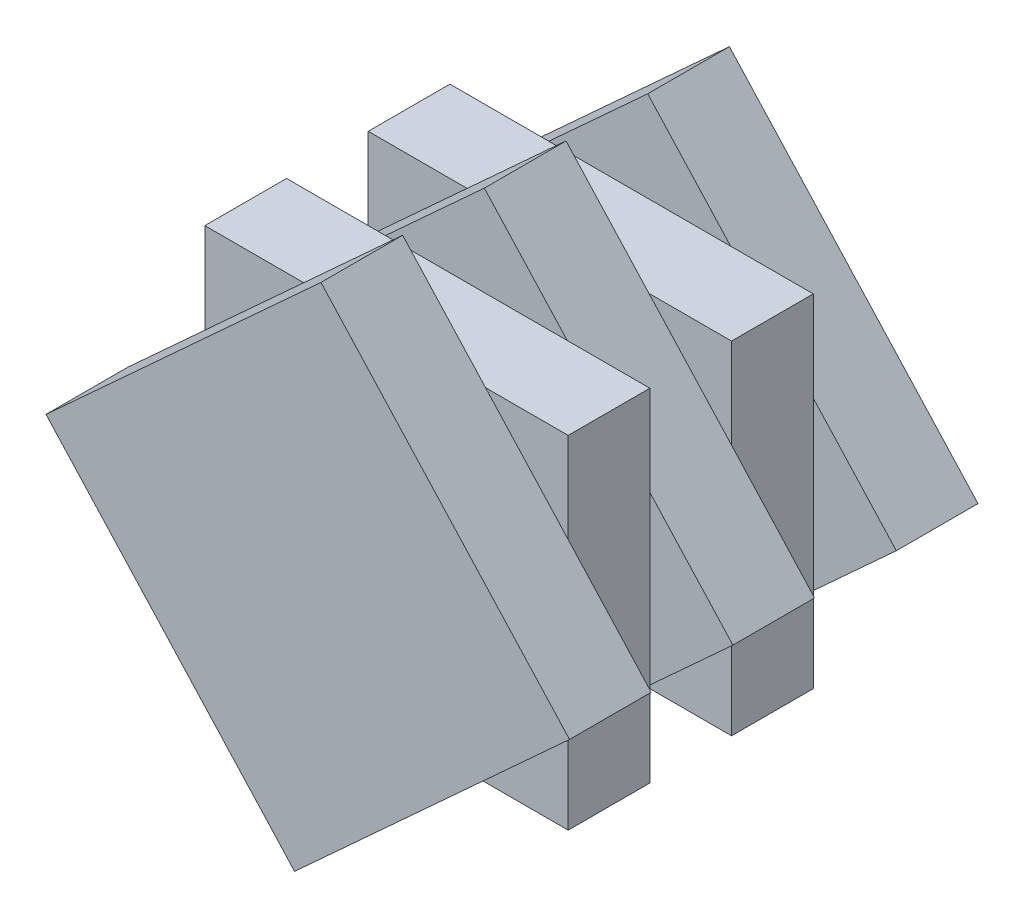
ISO-10303-21;
HEADER;
FILE_DESCRIPTION(('STEP AP214'),'2;1');
FILE_NAME('part.step','',(''),(''),'','','');
FILE_SCHEMA(('AUTOMOTIVE_DESIGN { 1 0 10303 214 1 1 1 1 }'));
ENDSEC;
DATA;
#1=APPLICATION_CONTEXT('core data for automotive mechanical design processes');
#2=APPLICATION_PROTOCOL_DEFINITION('international standard','automotive_design',2000,#1);
#3=PRODUCT_CONTEXT('',#1,'mechanical');
#4=PRODUCT('Part','Part','',(#3));
#5=PRODUCT_RELATED_PRODUCT_CATEGORY('part','',(#4));
#6=PRODUCT_DEFINITION_FORMATION('','',#4);
#7=PRODUCT_DEFINITION_CONTEXT('part definition',#1,'design');
#8=PRODUCT_DEFINITION('design','',#6,#7);
#9=PRODUCT_DEFINITION_SHAPE('','',#8);
#10=(LENGTH_UNIT() NAMED_UNIT(*) SI_UNIT(.MILLI.,.METRE.));
#11=(NAMED_UNIT(*) PLANE_ANGLE_UNIT() SI_UNIT($,.RADIAN.));
#12=(NAMED_UNIT(*) SI_UNIT($,.STERADIAN.) SOLID_ANGLE_UNIT());
#13=UNCERTAINTY_MEASURE_WITH_UNIT(LENGTH_MEASURE(1.E-05),#10,'distance_accuracy_value','');
#14=(GEOMETRIC_REPRESENTATION_CONTEXT(3) GLOBAL_UNCERTAINTY_ASSIGNED_CONTEXT((#13)) GLOBAL_UNIT_ASSIGNED_CONTEXT((#10,
#11,#12)) REPRESENTATION_CONTEXT('',''));
#15=CARTESIAN_POINT('',(0.,0.,0.));
#16=DIRECTION('',(0.,0.,1.));
#17=DIRECTION('',(1.,0.,0.));
#18=AXIS2_PLACEMENT_3D('',#15,#16,#17);
#19=CARTESIAN_POINT('',(0.,0.,0.));
#20=DIRECTION('',(0.,0.,1.));
#21=DIRECTION('',(1.,0.,0.));
#22=AXIS2_PLACEMENT_3D('',#19,#20,#21);
#23=PLANE('',#22);
#24=DIRECTION('',(0.,-1.,0.));
#25=VECTOR('',#24,1.);
#26=CARTESIAN_POINT('',(-55.5984454207503,52.3150726596823,0.));
#27=LINE('',#26,#25);
#28=CARTESIAN_POINT('',(-55.5984454207503,-22.8034381181716,0.));
#29=VERTEX_POINT('',#28);
#30=CARTESIAN_POINT('',(-55.5984454207503,-52.3150726596823,0.));
#31=VERTEX_POINT('',#30);
#32=EDGE_CURVE('E477',#29,#31,#27,.T.);
#33=ORIENTED_EDGE('',*,*,#32,.F.);
#34=DIRECTION('',(0.675307046547055,-0.737536706126477,0.));
#35=VECTOR('',#34,1.);
#36=CARTESIAN_POINT('',(-3.13282413407734,-80.1037753595892,0.));
#37=LINE('',#36,#35);
#38=CARTESIAN_POINT('',(-28.5768550436796,-52.3150726596823,0.));
#39=VERTEX_POINT('',#38);
#40=EDGE_CURVE('E11',#29,#39,#37,.T.);
#41=ORIENTED_EDGE('',*,*,#40,.T.);
#42=DIRECTION('',(1.,0.,0.));
#43=VECTOR('',#42,1.);
#44=CARTESIAN_POINT('',(-55.5984454207503,-52.3150726596823,0.));
#45=LINE('',#44,#43);
#46=EDGE_CURVE('E484',#31,#39,#45,.T.);
#47=ORIENTED_EDGE('',*,*,#46,.F.);
#48=EDGE_LOOP('',(#33,#41,#47));
#49=FACE_BOUND('',#48,.T.);
#50=ADVANCED_FACE('F39',(#49),#23,.F.);
#51=CARTESIAN_POINT('',(27.2166122617254,-52.3150726596823,0.));
#52=VERTEX_POINT('',#51);
#53=CARTESIAN_POINT('',(55.5984454207503,-52.3150726596823,0.));
#54=VERTEX_POINT('',#53);
#55=EDGE_CURVE('E482',#52,#54,#45,.T.);
#56=ORIENTED_EDGE('',*,*,#55,.F.);
#57=DIRECTION('',(0.737536706126477,0.675307046547055,0.));
#58=VECTOR('',#57,1.);
#59=CARTESIAN_POINT('',(-3.13282413407734,-80.1037753595892,0.));
#60=LINE('',#59,#58);
#61=CARTESIAN_POINT('',(55.5984454207503,-26.3279566734502,0.));
#62=VERTEX_POINT('',#61);
#63=EDGE_CURVE('E48',#52,#62,#60,.T.);
#64=ORIENTED_EDGE('',*,*,#63,.T.);
#65=DIRECTION('',(0.,1.,0.));
#66=VECTOR('',#65,1.);
#67=CARTESIAN_POINT('',(55.5984454207503,52.3150726596823,0.));
#68=LINE('',#67,#66);
#69=EDGE_CURVE('E469',#54,#62,#68,.T.);
#70=ORIENTED_EDGE('',*,*,#69,.F.);
#71=EDGE_LOOP('',(#56,#64,#70));
#72=FACE_BOUND('',#71,.T.);
#73=ADVANCED_FACE('F585',(#72),#23,.F.);
#74=CARTESIAN_POINT('',(55.5984454207503,24.6958593374742,0.));
#75=VERTEX_POINT('',#74);
#76=CARTESIAN_POINT('',(55.5984454207503,52.3150726596823,0.));
#77=VERTEX_POINT('',#76);
#78=EDGE_CURVE('E448',#75,#77,#68,.T.);
#79=ORIENTED_EDGE('',*,*,#78,.F.);
#80=DIRECTION('',(-0.675307046547055,0.737536706126477,0.));
#81=VECTOR('',#80,1.);
#82=CARTESIAN_POINT('',(81.0115577835478,-3.05907566626378,0.));
#83=LINE('',#82,#81);
#84=CARTESIAN_POINT('',(30.3096032226035,52.3150726596823,0.));
#85=VERTEX_POINT('',#84);
#86=EDGE_CURVE('E531',#75,#85,#83,.T.);
#87=ORIENTED_EDGE('',*,*,#86,.T.);
#88=DIRECTION('',(-1.,0.,0.));
#89=VECTOR('',#88,1.);
#90=CARTESIAN_POINT('',(-55.5984454207503,52.3150726596823,0.));
#91=LINE('',#90,#89);
#92=EDGE_CURVE('E474',#77,#85,#91,.T.);
#93=ORIENTED_EDGE('',*,*,#92,.F.);
#94=EDGE_LOOP('',(#79,#87,#93));
#95=FACE_BOUND('',#94,.T.);
#96=ADVANCED_FACE('F530',(#95),#23,.F.);
#97=CARTESIAN_POINT('',(0.,0.,75.));
#98=DIRECTION('',(0.,0.,1.));
#99=DIRECTION('',(1.,0.,0.));
#100=AXIS2_PLACEMENT_3D('',#97,#98,#99);
#101=PLANE('',#100);
#102=DIRECTION('',(0.675307046547055,-0.737536706126477,0.));
#103=VECTOR('',#102,1.);
#104=CARTESIAN_POINT('',(-3.13282413407734,-80.1037753595892,75.));
#105=LINE('',#104,#103);
#106=CARTESIAN_POINT('',(-55.5984454207503,-22.8034381181716,75.));
#107=VERTEX_POINT('',#106);
#108=CARTESIAN_POINT('',(-28.5768550436796,-52.3150726596823,75.));
#109=VERTEX_POINT('',#108);
#110=EDGE_CURVE('E304',#107,#109,#105,.T.);
#111=ORIENTED_EDGE('',*,*,#110,.F.);
#112=DIRECTION('',(0.,-1.,0.));
#113=VECTOR('',#112,1.);
#114=CARTESIAN_POINT('',(-55.5984454207503,52.3150726596823,75.));
#115=LINE('',#114,#113);
#116=CARTESIAN_POINT('',(-55.5984454207503,-52.3150726596823,75.));
#117=VERTEX_POINT('',#116);
#118=EDGE_CURVE('E355',#107,#117,#115,.T.);
#119=ORIENTED_EDGE('',*,*,#118,.T.);
#120=DIRECTION('',(1.,0.,0.));
#121=VECTOR('',#120,1.);
#122=CARTESIAN_POINT('',(-55.5984454207503,-52.3150726596823,75.));
#123=LINE('',#122,#121);
#124=EDGE_CURVE('E362',#117,#109,#123,.T.);
#125=ORIENTED_EDGE('',*,*,#124,.T.);
#126=EDGE_LOOP('',(#111,#119,#125));
#127=FACE_BOUND('',#126,.T.);
#128=ADVANCED_FACE('F615',(#127),#101,.T.);
#129=DIRECTION('',(-0.737536706126477,-0.675307046547055,0.));
#130=VECTOR('',#129,1.);
#131=CARTESIAN_POINT('',(-79.2066084037279,2.98022111238414,75.));
#132=LINE('',#131,#130);
#133=CARTESIAN_POINT('',(-25.3255418674295,52.3150726596823,75.));
#134=VERTEX_POINT('',#133);
#135=CARTESIAN_POINT('',(-55.5984454207503,24.596445343673,75.));
#136=VERTEX_POINT('',#135);
#137=EDGE_CURVE('E334',#134,#136,#132,.T.);
#138=ORIENTED_EDGE('',*,*,#137,.F.);
#139=DIRECTION('',(-1.,0.,0.));
#140=VECTOR('',#139,1.);
#141=CARTESIAN_POINT('',(-55.5984454207503,52.3150726596823,75.));
#142=LINE('',#141,#140);
#143=CARTESIAN_POINT('',(-55.5984454207503,52.3150726596823,75.));
#144=VERTEX_POINT('',#143);
#145=EDGE_CURVE('E349',#134,#144,#142,.T.);
#146=ORIENTED_EDGE('',*,*,#145,.T.);
#147=EDGE_CURVE('E357',#144,#136,#115,.T.);
#148=ORIENTED_EDGE('',*,*,#147,.T.);
#149=EDGE_LOOP('',(#138,#146,#148));
#150=FACE_BOUND('',#149,.T.);
#151=ADVANCED_FACE('F621',(#150),#101,.T.);
#152=DIRECTION('',(-0.675307046547055,0.737536706126477,0.));
#153=VECTOR('',#152,1.);
#154=CARTESIAN_POINT('',(81.0115577835478,-3.05907566626378,75.));
#155=LINE('',#154,#153);
#156=CARTESIAN_POINT('',(55.5984454207503,24.6958593374742,75.));
#157=VERTEX_POINT('',#156);
#158=CARTESIAN_POINT('',(30.3096032226035,52.3150726596823,75.));
#159=VERTEX_POINT('',#158);
#160=EDGE_CURVE('E331',#157,#159,#155,.T.);
#161=ORIENTED_EDGE('',*,*,#160,.F.);
#162=DIRECTION('',(0.,1.,0.));
#163=VECTOR('',#162,1.);
#164=CARTESIAN_POINT('',(55.5984454207503,52.3150726596823,75.));
#165=LINE('',#164,#163);
#166=CARTESIAN_POINT('',(55.5984454207503,52.3150726596823,75.));
#167=VERTEX_POINT('',#166);
#168=EDGE_CURVE('E351',#157,#167,#165,.T.);
#169=ORIENTED_EDGE('',*,*,#168,.T.);
#170=EDGE_CURVE('E352',#167,#159,#142,.T.);
#171=ORIENTED_EDGE('',*,*,#170,.T.);
#172=EDGE_LOOP('',(#161,#169,#171));
#173=FACE_BOUND('',#172,.T.);
#174=ADVANCED_FACE('F720',(#173),#101,.T.);
#175=CARTESIAN_POINT('',(0.,0.,50.));
#176=DIRECTION('',(0.,0.,-1.));
#177=DIRECTION('',(-1.,0.,0.));
#178=AXIS2_PLACEMENT_3D('',#175,#176,#177);
#179=PLANE('',#178);
#180=DIRECTION('',(0.,1.,0.));
#181=VECTOR('',#180,1.);
#182=CARTESIAN_POINT('',(55.5984454207503,52.3150726596823,50.));
#183=LINE('',#182,#181);
#184=CARTESIAN_POINT('',(55.5984454207503,-26.3279566734502,50.));
#185=VERTEX_POINT('',#184);
#186=CARTESIAN_POINT('',(55.5984454207503,24.6958593374742,50.));
#187=VERTEX_POINT('',#186);
#188=EDGE_CURVE('E371',#185,#187,#183,.T.);
#189=ORIENTED_EDGE('',*,*,#188,.F.);
#190=DIRECTION('',(0.737536706126477,0.675307046547055,0.));
#191=VECTOR('',#190,1.);
#192=CARTESIAN_POINT('',(-3.13282413407734,-80.1037753595892,50.));
#193=LINE('',#192,#191);
#194=CARTESIAN_POINT('',(81.0115577835478,-3.05907566626378,50.));
#195=VERTEX_POINT('',#194);
#196=EDGE_CURVE('E401',#185,#195,#193,.T.);
#197=ORIENTED_EDGE('',*,*,#196,.T.);
#198=DIRECTION('',(-0.675307046547055,0.737536706126477,0.));
#199=VECTOR('',#198,1.);
#200=CARTESIAN_POINT('',(81.0115577835478,-3.05907566626378,50.));
#201=LINE('',#200,#199);
#202=EDGE_CURVE('E409',#195,#187,#201,.T.);
#203=ORIENTED_EDGE('',*,*,#202,.T.);
#204=EDGE_LOOP('',(#189,#197,#203));
#205=FACE_BOUND('',#204,.T.);
#206=ADVANCED_FACE('F836',(#205),#179,.F.);
#207=DIRECTION('',(1.,0.,0.));
#208=VECTOR('',#207,1.);
#209=CARTESIAN_POINT('',(-55.5984454207503,-52.3150726596823,50.));
#210=LINE('',#209,#208);
#211=CARTESIAN_POINT('',(-28.5768550436796,-52.3150726596823,50.));
#212=VERTEX_POINT('',#211);
#213=CARTESIAN_POINT('',(27.2166122617254,-52.3150726596823,50.));
#214=VERTEX_POINT('',#213);
#215=EDGE_CURVE('E385',#212,#214,#210,.T.);
#216=ORIENTED_EDGE('',*,*,#215,.F.);
#217=DIRECTION('',(0.675307046547055,-0.737536706126477,0.));
#218=VECTOR('',#217,1.);
#219=CARTESIAN_POINT('',(-3.13282413407734,-80.1037753595892,50.));
#220=LINE('',#219,#218);
#221=CARTESIAN_POINT('',(-3.13282413407734,-80.1037753595892,50.));
#222=VERTEX_POINT('',#221);
#223=EDGE_CURVE('E403',#212,#222,#220,.T.);
#224=ORIENTED_EDGE('',*,*,#223,.T.);
#225=EDGE_CURVE('E404',#222,#214,#193,.T.);
#226=ORIENTED_EDGE('',*,*,#225,.T.);
#227=EDGE_LOOP('',(#216,#224,#226));
#228=FACE_BOUND('',#227,.T.);
#229=ADVANCED_FACE('F843',(#228),#179,.F.);
#230=DIRECTION('',(0.,-1.,0.));
#231=VECTOR('',#230,1.);
#232=CARTESIAN_POINT('',(-55.5984454207503,52.3150726596823,50.));
#233=LINE('',#232,#231);
#234=CARTESIAN_POINT('',(-55.5984454207503,24.596445343673,50.));
#235=VERTEX_POINT('',#234);
#236=CARTESIAN_POINT('',(-55.5984454207503,-22.8034381181716,50.));
#237=VERTEX_POINT('',#236);
#238=EDGE_CURVE('E381',#235,#237,#233,.T.);
#239=ORIENTED_EDGE('',*,*,#238,.F.);
#240=DIRECTION('',(-0.737536706126477,-0.675307046547055,0.));
#241=VECTOR('',#240,1.);
#242=CARTESIAN_POINT('',(-79.2066084037279,2.98022111238414,50.));
#243=LINE('',#242,#241);
#244=CARTESIAN_POINT('',(-79.2066084037279,2.98022111238414,50.));
#245=VERTEX_POINT('',#244);
#246=EDGE_CURVE('E412',#235,#245,#243,.T.);
#247=ORIENTED_EDGE('',*,*,#246,.T.);
#248=EDGE_CURVE('E398',#245,#237,#220,.T.);
#249=ORIENTED_EDGE('',*,*,#248,.T.);
#250=EDGE_LOOP('',(#239,#247,#249));
#251=FACE_BOUND('',#250,.T.);
#252=ADVANCED_FACE('F833',(#251),#179,.F.);
#253=DIRECTION('',(-1.,0.,0.));
#254=VECTOR('',#253,1.);
#255=CARTESIAN_POINT('',(-55.5984454207503,52.3150726596823,50.));
#256=LINE('',#255,#254);
#257=CARTESIAN_POINT('',(30.3096032226034,52.3150726596823,50.));
#258=VERTEX_POINT('',#257);
#259=CARTESIAN_POINT('',(-25.3255418674295,52.3150726596823,50.));
#260=VERTEX_POINT('',#259);
#261=EDGE_CURVE('E376',#258,#260,#256,.T.);
#262=ORIENTED_EDGE('',*,*,#261,.F.);
#263=CARTESIAN_POINT('',(4.93777351389728,80.0249208057096,50.));
#264=VERTEX_POINT('',#263);
#265=EDGE_CURVE('E407',#258,#264,#201,.T.);
#266=ORIENTED_EDGE('',*,*,#265,.T.);
#267=EDGE_CURVE('E414',#264,#260,#243,.T.);
#268=ORIENTED_EDGE('',*,*,#267,.T.);
#269=EDGE_LOOP('',(#262,#266,#268));
#270=FACE_BOUND('',#269,.T.);
#271=ADVANCED_FACE('F829',(#270),#179,.F.);
#272=CARTESIAN_POINT('',(0.,0.,25.));
#273=DIRECTION('',(0.,0.,1.));
#274=DIRECTION('',(1.,0.,0.));
#275=AXIS2_PLACEMENT_3D('',#272,#273,#274);
#276=PLANE('',#275);
#277=DIRECTION('',(0.675307046547055,-0.737536706126477,0.));
#278=VECTOR('',#277,1.);
#279=CARTESIAN_POINT('',(-3.13282413407734,-80.1037753595892,25.));
#280=LINE('',#279,#278);
#281=CARTESIAN_POINT('',(-55.5984454207503,-22.8034381181716,25.));
#282=VERTEX_POINT('',#281);
#283=CARTESIAN_POINT('',(-28.5768550436796,-52.3150726596823,25.));
#284=VERTEX_POINT('',#283);
#285=EDGE_CURVE('E422',#282,#284,#280,.T.);
#286=ORIENTED_EDGE('',*,*,#285,.F.);
#287=DIRECTION('',(0.,-1.,0.));
#288=VECTOR('',#287,1.);
#289=CARTESIAN_POINT('',(-55.5984454207503,52.3150726596823,25.));
#290=LINE('',#289,#288);
#291=CARTESIAN_POINT('',(-55.5984454207503,-52.3150726596823,25.));
#292=VERTEX_POINT('',#291);
#293=EDGE_CURVE('E457',#282,#292,#290,.T.);
#294=ORIENTED_EDGE('',*,*,#293,.T.);
#295=DIRECTION('',(1.,0.,0.));
#296=VECTOR('',#295,1.);
#297=CARTESIAN_POINT('',(-55.5984454207503,-52.3150726596823,25.));
#298=LINE('',#297,#296);
#299=EDGE_CURVE('E464',#292,#284,#298,.T.);
#300=ORIENTED_EDGE('',*,*,#299,.T.);
#301=EDGE_LOOP('',(#286,#294,#300));
#302=FACE_BOUND('',#301,.T.);
#303=ADVANCED_FACE('F611',(#302),#276,.T.);
#304=DIRECTION('',(-0.737536706126477,-0.675307046547055,0.));
#305=VECTOR('',#304,1.);
#306=CARTESIAN_POINT('',(-79.2066084037279,2.98022111238414,25.));
#307=LINE('',#306,#305);
#308=CARTESIAN_POINT('',(-25.3255418674295,52.3150726596823,25.));
#309=VERTEX_POINT('',#308);
#310=CARTESIAN_POINT('',(-55.5984454207503,24.596445343673,25.));
#311=VERTEX_POINT('',#310);
#312=EDGE_CURVE('E436',#309,#311,#307,.T.);
#313=ORIENTED_EDGE('',*,*,#312,.F.);
#314=DIRECTION('',(-1.,0.,0.));
#315=VECTOR('',#314,1.);
#316=CARTESIAN_POINT('',(-55.5984454207503,52.3150726596823,25.));
#317=LINE('',#316,#315);
#318=CARTESIAN_POINT('',(-55.5984454207503,52.3150726596823,25.));
#319=VERTEX_POINT('',#318);
#320=EDGE_CURVE('E451',#309,#319,#317,.T.);
#321=ORIENTED_EDGE('',*,*,#320,.T.);
#322=EDGE_CURVE('E459',#319,#311,#290,.T.);
#323=ORIENTED_EDGE('',*,*,#322,.T.);
#324=EDGE_LOOP('',(#313,#321,#323));
#325=FACE_BOUND('',#324,.T.);
#326=ADVANCED_FACE('F906',(#325),#276,.T.);
#327=DIRECTION('',(-0.675307046547055,0.737536706126477,0.));
#328=VECTOR('',#327,1.);
#329=CARTESIAN_POINT('',(81.0115577835478,-3.05907566626378,25.));
#330=LINE('',#329,#328);
#331=CARTESIAN_POINT('',(55.5984454207503,24.6958593374742,25.));
#332=VERTEX_POINT('',#331);
#333=CARTESIAN_POINT('',(30.3096032226035,52.3150726596823,25.));
#334=VERTEX_POINT('',#333);
#335=EDGE_CURVE('E432',#332,#334,#330,.T.);
#336=ORIENTED_EDGE('',*,*,#335,.F.);
#337=DIRECTION('',(0.,1.,0.));
#338=VECTOR('',#337,1.);
#339=CARTESIAN_POINT('',(55.5984454207503,52.3150726596823,25.));
#340=LINE('',#339,#338);
#341=CARTESIAN_POINT('',(55.5984454207503,52.3150726596823,25.));
#342=VERTEX_POINT('',#341);
#343=EDGE_CURVE('E453',#332,#342,#340,.T.);
#344=ORIENTED_EDGE('',*,*,#343,.T.);
#345=EDGE_CURVE('E454',#342,#334,#317,.T.);
#346=ORIENTED_EDGE('',*,*,#345,.T.);
#347=EDGE_LOOP('',(#336,#344,#346));
#348=FACE_BOUND('',#347,.T.);
#349=ADVANCED_FACE('F520',(#348),#276,.T.);
#350=CARTESIAN_POINT('',(55.5984454207503,52.3150726596823,25.));
#351=DIRECTION('',(-1.,0.,0.));
#352=DIRECTION('',(0.,0.,1.));
#353=AXIS2_PLACEMENT_3D('',#350,#351,#352);
#354=PLANE('',#353);
#355=ORIENTED_EDGE('',*,*,#69,.T.);
#356=EDGE_CURVE('E473',#62,#75,#68,.T.);
#357=ORIENTED_EDGE('',*,*,#356,.T.);
#358=ORIENTED_EDGE('',*,*,#78,.T.);
#359=DIRECTION('',(0.,0.,-1.));
#360=VECTOR('',#359,1.);
#361=CARTESIAN_POINT('',(55.5984454207503,52.3150726596823,25.));
#362=LINE('',#361,#360);
#363=EDGE_CURVE('E43',#342,#77,#362,.T.);
#364=ORIENTED_EDGE('',*,*,#363,.F.);
#365=ORIENTED_EDGE('',*,*,#343,.F.);
#366=CARTESIAN_POINT('',(55.5984454207503,-26.3279566734502,25.));
#367=VERTEX_POINT('',#366);
#368=EDGE_CURVE('E452',#367,#332,#340,.T.);
#369=ORIENTED_EDGE('',*,*,#368,.F.);
#370=CARTESIAN_POINT('',(55.5984454207503,-52.3150726596823,25.));
#371=VERTEX_POINT('',#370);
#372=EDGE_CURVE('E449',#371,#367,#340,.T.);
#373=ORIENTED_EDGE('',*,*,#372,.F.);
#374=DIRECTION('',(0.,0.,-1.));
#375=VECTOR('',#374,1.);
#376=CARTESIAN_POINT('',(55.5984454207503,-52.3150726596823,25.));
#377=LINE('',#376,#375);
#378=EDGE_CURVE('E467',#371,#54,#377,.T.);
#379=ORIENTED_EDGE('',*,*,#378,.T.);
#380=EDGE_LOOP('',(#355,#357,#358,#364,#365,#369,#373,#379));
#381=FACE_BOUND('',#380,.T.);
#382=ADVANCED_FACE('F41',(#381),#354,.F.);
#383=CARTESIAN_POINT('',(-55.5984454207503,52.3150726596823,25.));
#384=DIRECTION('',(0.,-1.,0.));
#385=DIRECTION('',(0.,0.,-1.));
#386=AXIS2_PLACEMENT_3D('',#383,#384,#385);
#387=PLANE('',#386);
#388=ORIENTED_EDGE('',*,*,#92,.T.);
#389=CARTESIAN_POINT('',(-25.3255418674295,52.3150726596823,0.));
#390=VERTEX_POINT('',#389);
#391=EDGE_CURVE('E478',#85,#390,#91,.T.);
#392=ORIENTED_EDGE('',*,*,#391,.T.);
#393=CARTESIAN_POINT('',(-55.5984454207503,52.3150726596823,0.));
#394=VERTEX_POINT('',#393);
#395=EDGE_CURVE('E472',#390,#394,#91,.T.);
#396=ORIENTED_EDGE('',*,*,#395,.T.);
#397=DIRECTION('',(0.,0.,-1.));
#398=VECTOR('',#397,1.);
#399=CARTESIAN_POINT('',(-55.5984454207503,52.3150726596823,25.));
#400=LINE('',#399,#398);
#401=EDGE_CURVE('E491',#319,#394,#400,.T.);
#402=ORIENTED_EDGE('',*,*,#401,.F.);
#403=ORIENTED_EDGE('',*,*,#320,.F.);
#404=EDGE_CURVE('E458',#334,#309,#317,.T.);
#405=ORIENTED_EDGE('',*,*,#404,.F.);
#406=ORIENTED_EDGE('',*,*,#345,.F.);
#407=ORIENTED_EDGE('',*,*,#363,.T.);
#408=EDGE_LOOP('',(#388,#392,#396,#402,#403,#405,#406,#407));
#409=FACE_BOUND('',#408,.T.);
#410=ADVANCED_FACE('F522',(#409),#387,.F.);
#411=CARTESIAN_POINT('',(-55.5984454207503,52.3150726596823,25.));
#412=DIRECTION('',(1.,0.,0.));
#413=DIRECTION('',(0.,0.,-1.));
#414=AXIS2_PLACEMENT_3D('',#411,#412,#413);
#415=PLANE('',#414);
#416=CARTESIAN_POINT('',(-55.5984454207503,24.596445343673,0.));
#417=VERTEX_POINT('',#416);
#418=EDGE_CURVE('E479',#394,#417,#27,.T.);
#419=ORIENTED_EDGE('',*,*,#418,.T.);
#420=EDGE_CURVE('E483',#417,#29,#27,.T.);
#421=ORIENTED_EDGE('',*,*,#420,.T.);
#422=ORIENTED_EDGE('',*,*,#32,.T.);
#423=DIRECTION('',(0.,0.,-1.));
#424=VECTOR('',#423,1.);
#425=CARTESIAN_POINT('',(-55.5984454207503,-52.3150726596823,25.));
#426=LINE('',#425,#424);
#427=EDGE_CURVE('E489',#292,#31,#426,.T.);
#428=ORIENTED_EDGE('',*,*,#427,.F.);
#429=ORIENTED_EDGE('',*,*,#293,.F.);
#430=EDGE_CURVE('E463',#311,#282,#290,.T.);
#431=ORIENTED_EDGE('',*,*,#430,.F.);
#432=ORIENTED_EDGE('',*,*,#322,.F.);
#433=ORIENTED_EDGE('',*,*,#401,.T.);
#434=EDGE_LOOP('',(#419,#421,#422,#428,#429,#431,#432,#433));
#435=FACE_BOUND('',#434,.T.);
#436=ADVANCED_FACE('F595',(#435),#415,.F.);
#437=CARTESIAN_POINT('',(-55.5984454207503,-52.3150726596823,25.));
#438=DIRECTION('',(0.,1.,0.));
#439=DIRECTION('',(0.,0.,1.));
#440=AXIS2_PLACEMENT_3D('',#437,#438,#439);
#441=PLANE('',#440);
#442=ORIENTED_EDGE('',*,*,#46,.T.);
#443=EDGE_CURVE('E281',#39,#52,#45,.T.);
#444=ORIENTED_EDGE('',*,*,#443,.T.);
#445=ORIENTED_EDGE('',*,*,#55,.T.);
#446=ORIENTED_EDGE('',*,*,#378,.F.);
#447=CARTESIAN_POINT('',(27.2166122617254,-52.3150726596823,25.));
#448=VERTEX_POINT('',#447);
#449=EDGE_CURVE('E462',#448,#371,#298,.T.);
#450=ORIENTED_EDGE('',*,*,#449,.F.);
#451=EDGE_CURVE('E468',#284,#448,#298,.T.);
#452=ORIENTED_EDGE('',*,*,#451,.F.);
#453=ORIENTED_EDGE('',*,*,#299,.F.);
#454=ORIENTED_EDGE('',*,*,#427,.T.);
#455=EDGE_LOOP('',(#442,#444,#445,#446,#450,#452,#453,#454));
#456=FACE_BOUND('',#455,.T.);
#457=ADVANCED_FACE('F589',(#456),#441,.F.);
#458=DIRECTION('',(0.737536706126477,0.675307046547055,0.));
#459=VECTOR('',#458,1.);
#460=CARTESIAN_POINT('',(-3.13282413407734,-80.1037753595892,25.));
#461=LINE('',#460,#459);
#462=EDGE_CURVE('E427',#448,#367,#461,.T.);
#463=ORIENTED_EDGE('',*,*,#462,.F.);
#464=ORIENTED_EDGE('',*,*,#449,.T.);
#465=ORIENTED_EDGE('',*,*,#372,.T.);
#466=EDGE_LOOP('',(#463,#464,#465));
#467=FACE_BOUND('',#466,.T.);
#468=ADVANCED_FACE('F598',(#467),#276,.T.);
#469=ORIENTED_EDGE('',*,*,#395,.F.);
#470=DIRECTION('',(-0.737536706126477,-0.675307046547055,0.));
#471=VECTOR('',#470,1.);
#472=CARTESIAN_POINT('',(-79.2066084037279,2.98022111238414,0.));
#473=LINE('',#472,#471);
#474=EDGE_CURVE('E549',#390,#417,#473,.T.);
#475=ORIENTED_EDGE('',*,*,#474,.T.);
#476=ORIENTED_EDGE('',*,*,#418,.F.);
#477=EDGE_LOOP('',(#469,#475,#476));
#478=FACE_BOUND('',#477,.T.);
#479=ADVANCED_FACE('F596',(#478),#23,.F.);
#480=CARTESIAN_POINT('',(0.,0.,25.));
#481=DIRECTION('',(0.,0.,-1.));
#482=DIRECTION('',(-1.,0.,0.));
#483=AXIS2_PLACEMENT_3D('',#480,#481,#482);
#484=PLANE('',#483);
#485=CARTESIAN_POINT('',(81.0115577835478,-3.05907566626378,25.));
#486=VERTEX_POINT('',#485);
#487=EDGE_CURVE('E421',#367,#486,#461,.T.);
#488=ORIENTED_EDGE('',*,*,#487,.F.);
#489=ORIENTED_EDGE('',*,*,#368,.T.);
#490=EDGE_CURVE('E428',#486,#332,#330,.T.);
#491=ORIENTED_EDGE('',*,*,#490,.F.);
#492=EDGE_LOOP('',(#488,#489,#491));
#493=FACE_BOUND('',#492,.T.);
#494=ADVANCED_FACE('F514',(#493),#484,.T.);
#495=CARTESIAN_POINT('',(4.93777351389728,80.0249208057096,25.));
#496=VERTEX_POINT('',#495);
#497=EDGE_CURVE('E426',#334,#496,#330,.T.);
#498=ORIENTED_EDGE('',*,*,#497,.F.);
#499=ORIENTED_EDGE('',*,*,#404,.T.);
#500=EDGE_CURVE('E433',#496,#309,#307,.T.);
#501=ORIENTED_EDGE('',*,*,#500,.F.);
#502=EDGE_LOOP('',(#498,#499,#501));
#503=FACE_BOUND('',#502,.T.);
#504=ADVANCED_FACE('F605',(#503),#484,.T.);
#505=CARTESIAN_POINT('',(-79.2066084037279,2.98022111238414,25.));
#506=VERTEX_POINT('',#505);
#507=EDGE_CURVE('E431',#311,#506,#307,.T.);
#508=ORIENTED_EDGE('',*,*,#507,.F.);
#509=ORIENTED_EDGE('',*,*,#430,.T.);
#510=EDGE_CURVE('E418',#506,#282,#280,.T.);
#511=ORIENTED_EDGE('',*,*,#510,.F.);
#512=EDGE_LOOP('',(#508,#509,#511));
#513=FACE_BOUND('',#512,.T.);
#514=ADVANCED_FACE('F822',(#513),#484,.T.);
#515=CARTESIAN_POINT('',(-3.13282413407734,-80.1037753595892,50.));
#516=DIRECTION('',(0.737536706126477,0.675307046547055,0.));
#517=DIRECTION('',(-0.675307046547055,0.737536706126477,0.));
#518=AXIS2_PLACEMENT_3D('',#515,#516,#517);
#519=PLANE('',#518);
#520=ORIENTED_EDGE('',*,*,#510,.T.);
#521=ORIENTED_EDGE('',*,*,#285,.T.);
#522=CARTESIAN_POINT('',(-3.13282413407734,-80.1037753595892,25.));
#523=VERTEX_POINT('',#522);
#524=EDGE_CURVE('E397',#284,#523,#280,.T.);
#525=ORIENTED_EDGE('',*,*,#524,.T.);
#526=DIRECTION('',(0.,0.,-1.));
#527=VECTOR('',#526,1.);
#528=CARTESIAN_POINT('',(-3.13282413407734,-80.1037753595892,50.));
#529=LINE('',#528,#527);
#530=EDGE_CURVE('E445',#222,#523,#529,.T.);
#531=ORIENTED_EDGE('',*,*,#530,.F.);
#532=ORIENTED_EDGE('',*,*,#223,.F.);
#533=EDGE_CURVE('E402',#237,#212,#220,.T.);
#534=ORIENTED_EDGE('',*,*,#533,.F.);
#535=ORIENTED_EDGE('',*,*,#248,.F.);
#536=DIRECTION('',(0.,0.,-1.));
#537=VECTOR('',#536,1.);
#538=CARTESIAN_POINT('',(-79.2066084037279,2.98022111238414,50.));
#539=LINE('',#538,#537);
#540=EDGE_CURVE('E416',#245,#506,#539,.T.);
#541=ORIENTED_EDGE('',*,*,#540,.T.);
#542=EDGE_LOOP('',(#520,#521,#525,#531,#532,#534,#535,#541));
#543=FACE_BOUND('',#542,.T.);
#544=ADVANCED_FACE('F814',(#543),#519,.F.);
#545=CARTESIAN_POINT('',(-3.13282413407734,-80.1037753595892,50.));
#546=DIRECTION('',(-0.675307046547055,0.737536706126477,0.));
#547=DIRECTION('',(-0.737536706126477,-0.675307046547055,0.));
#548=AXIS2_PLACEMENT_3D('',#545,#546,#547);
#549=PLANE('',#548);
#550=EDGE_CURVE('E423',#523,#448,#461,.T.);
#551=ORIENTED_EDGE('',*,*,#550,.T.);
#552=ORIENTED_EDGE('',*,*,#462,.T.);
#553=ORIENTED_EDGE('',*,*,#487,.T.);
#554=DIRECTION('',(0.,0.,-1.));
#555=VECTOR('',#554,1.);
#556=CARTESIAN_POINT('',(81.0115577835478,-3.05907566626378,50.));
#557=LINE('',#556,#555);
#558=EDGE_CURVE('E442',#195,#486,#557,.T.);
#559=ORIENTED_EDGE('',*,*,#558,.F.);
#560=ORIENTED_EDGE('',*,*,#196,.F.);
#561=EDGE_CURVE('E408',#214,#185,#193,.T.);
#562=ORIENTED_EDGE('',*,*,#561,.F.);
#563=ORIENTED_EDGE('',*,*,#225,.F.);
#564=ORIENTED_EDGE('',*,*,#530,.T.);
#565=EDGE_LOOP('',(#551,#552,#553,#559,#560,#562,#563,#564));
#566=FACE_BOUND('',#565,.T.);
#567=ADVANCED_FACE('F506',(#566),#549,.F.);
#568=CARTESIAN_POINT('',(81.0115577835478,-3.05907566626378,50.));
#569=DIRECTION('',(-0.737536706126477,-0.675307046547055,0.));
#570=DIRECTION('',(0.675307046547055,-0.737536706126477,0.));
#571=AXIS2_PLACEMENT_3D('',#568,#569,#570);
#572=PLANE('',#571);
#573=ORIENTED_EDGE('',*,*,#490,.T.);
#574=ORIENTED_EDGE('',*,*,#335,.T.);
#575=ORIENTED_EDGE('',*,*,#497,.T.);
#576=DIRECTION('',(0.,0.,-1.));
#577=VECTOR('',#576,1.);
#578=CARTESIAN_POINT('',(4.93777351389728,80.0249208057096,50.));
#579=LINE('',#578,#577);
#580=EDGE_CURVE('E439',#264,#496,#579,.T.);
#581=ORIENTED_EDGE('',*,*,#580,.F.);
#582=ORIENTED_EDGE('',*,*,#265,.F.);
#583=EDGE_CURVE('E413',#187,#258,#201,.T.);
#584=ORIENTED_EDGE('',*,*,#583,.F.);
#585=ORIENTED_EDGE('',*,*,#202,.F.);
#586=ORIENTED_EDGE('',*,*,#558,.T.);
#587=EDGE_LOOP('',(#573,#574,#575,#581,#582,#584,#585,#586));
#588=FACE_BOUND('',#587,.T.);
#589=ADVANCED_FACE('F513',(#588),#572,.F.);
#590=CARTESIAN_POINT('',(-79.2066084037279,2.98022111238414,50.));
#591=DIRECTION('',(0.675307046547055,-0.737536706126477,0.));
#592=DIRECTION('',(0.737536706126477,0.675307046547055,0.));
#593=AXIS2_PLACEMENT_3D('',#590,#591,#592);
#594=PLANE('',#593);
#595=ORIENTED_EDGE('',*,*,#500,.T.);
#596=ORIENTED_EDGE('',*,*,#312,.T.);
#597=ORIENTED_EDGE('',*,*,#507,.T.);
#598=ORIENTED_EDGE('',*,*,#540,.F.);
#599=ORIENTED_EDGE('',*,*,#246,.F.);
#600=EDGE_CURVE('E417',#260,#235,#243,.T.);
#601=ORIENTED_EDGE('',*,*,#600,.F.);
#602=ORIENTED_EDGE('',*,*,#267,.F.);
#603=ORIENTED_EDGE('',*,*,#580,.T.);
#604=EDGE_LOOP('',(#595,#596,#597,#598,#599,#601,#602,#603));
#605=FACE_BOUND('',#604,.T.);
#606=ADVANCED_FACE('F794',(#605),#594,.F.);
#607=ORIENTED_EDGE('',*,*,#524,.F.);
#608=ORIENTED_EDGE('',*,*,#451,.T.);
#609=ORIENTED_EDGE('',*,*,#550,.F.);
#610=EDGE_LOOP('',(#607,#608,#609));
#611=FACE_BOUND('',#610,.T.);
#612=ADVANCED_FACE('F607',(#611),#484,.T.);
#613=CARTESIAN_POINT('',(0.,0.,50.));
#614=DIRECTION('',(0.,0.,1.));
#615=DIRECTION('',(1.,0.,0.));
#616=AXIS2_PLACEMENT_3D('',#613,#614,#615);
#617=PLANE('',#616);
#618=CARTESIAN_POINT('',(-55.5984454207503,-52.3150726596823,50.));
#619=VERTEX_POINT('',#618);
#620=EDGE_CURVE('E375',#237,#619,#233,.T.);
#621=ORIENTED_EDGE('',*,*,#620,.F.);
#622=ORIENTED_EDGE('',*,*,#533,.T.);
#623=EDGE_CURVE('E382',#619,#212,#210,.T.);
#624=ORIENTED_EDGE('',*,*,#623,.F.);
#625=EDGE_LOOP('',(#621,#622,#624));
#626=FACE_BOUND('',#625,.T.);
#627=ADVANCED_FACE('F767',(#626),#617,.F.);
#628=CARTESIAN_POINT('',(55.5984454207503,-52.3150726596823,50.));
#629=VERTEX_POINT('',#628);
#630=EDGE_CURVE('E380',#214,#629,#210,.T.);
#631=ORIENTED_EDGE('',*,*,#630,.F.);
#632=ORIENTED_EDGE('',*,*,#561,.T.);
#633=EDGE_CURVE('E367',#629,#185,#183,.T.);
#634=ORIENTED_EDGE('',*,*,#633,.F.);
#635=EDGE_LOOP('',(#631,#632,#634));
#636=FACE_BOUND('',#635,.T.);
#637=ADVANCED_FACE('F774',(#636),#617,.F.);
#638=CARTESIAN_POINT('',(55.5984454207503,52.3150726596823,50.));
#639=VERTEX_POINT('',#638);
#640=EDGE_CURVE('E346',#187,#639,#183,.T.);
#641=ORIENTED_EDGE('',*,*,#640,.F.);
#642=ORIENTED_EDGE('',*,*,#583,.T.);
#643=EDGE_CURVE('E372',#639,#258,#256,.T.);
#644=ORIENTED_EDGE('',*,*,#643,.F.);
#645=EDGE_LOOP('',(#641,#642,#644));
#646=FACE_BOUND('',#645,.T.);
#647=ADVANCED_FACE('F764',(#646),#617,.F.);
#648=CARTESIAN_POINT('',(-55.5984454207503,52.3150726596823,50.));
#649=VERTEX_POINT('',#648);
#650=EDGE_CURVE('E370',#260,#649,#256,.T.);
#651=ORIENTED_EDGE('',*,*,#650,.F.);
#652=ORIENTED_EDGE('',*,*,#600,.T.);
#653=EDGE_CURVE('E377',#649,#235,#233,.T.);
#654=ORIENTED_EDGE('',*,*,#653,.F.);
#655=EDGE_LOOP('',(#651,#652,#654));
#656=FACE_BOUND('',#655,.T.);
#657=ADVANCED_FACE('F755',(#656),#617,.F.);
#658=CARTESIAN_POINT('',(55.5984454207503,52.3150726596823,75.));
#659=DIRECTION('',(-1.,0.,0.));
#660=DIRECTION('',(0.,0.,1.));
#661=AXIS2_PLACEMENT_3D('',#658,#659,#660);
#662=PLANE('',#661);
#663=ORIENTED_EDGE('',*,*,#633,.T.);
#664=ORIENTED_EDGE('',*,*,#188,.T.);
#665=ORIENTED_EDGE('',*,*,#640,.T.);
#666=DIRECTION('',(0.,0.,-1.));
#667=VECTOR('',#666,1.);
#668=CARTESIAN_POINT('',(55.5984454207503,52.3150726596823,75.));
#669=LINE('',#668,#667);
#670=EDGE_CURVE('E394',#167,#639,#669,.T.);
#671=ORIENTED_EDGE('',*,*,#670,.F.);
#672=ORIENTED_EDGE('',*,*,#168,.F.);
#673=CARTESIAN_POINT('',(55.5984454207503,-26.3279566734502,75.));
#674=VERTEX_POINT('',#673);
#675=EDGE_CURVE('E350',#674,#157,#165,.T.);
#676=ORIENTED_EDGE('',*,*,#675,.F.);
#677=CARTESIAN_POINT('',(55.5984454207503,-52.3150726596823,75.));
#678=VERTEX_POINT('',#677);
#679=EDGE_CURVE('E347',#678,#674,#165,.T.);
#680=ORIENTED_EDGE('',*,*,#679,.F.);
#681=DIRECTION('',(0.,0.,-1.));
#682=VECTOR('',#681,1.);
#683=CARTESIAN_POINT('',(55.5984454207503,-52.3150726596823,75.));
#684=LINE('',#683,#682);
#685=EDGE_CURVE('E365',#678,#629,#684,.T.);
#686=ORIENTED_EDGE('',*,*,#685,.T.);
#687=EDGE_LOOP('',(#663,#664,#665,#671,#672,#676,#680,#686));
#688=FACE_BOUND('',#687,.T.);
#689=ADVANCED_FACE('F746',(#688),#662,.F.);
#690=CARTESIAN_POINT('',(-55.5984454207503,52.3150726596823,75.));
#691=DIRECTION('',(0.,-1.,0.));
#692=DIRECTION('',(0.,0.,-1.));
#693=AXIS2_PLACEMENT_3D('',#690,#691,#692);
#694=PLANE('',#693);
#695=ORIENTED_EDGE('',*,*,#643,.T.);
#696=ORIENTED_EDGE('',*,*,#261,.T.);
#697=ORIENTED_EDGE('',*,*,#650,.T.);
#698=DIRECTION('',(0.,0.,-1.));
#699=VECTOR('',#698,1.);
#700=CARTESIAN_POINT('',(-55.5984454207503,52.3150726596823,75.));
#701=LINE('',#700,#699);
#702=EDGE_CURVE('E391',#144,#649,#701,.T.);
#703=ORIENTED_EDGE('',*,*,#702,.F.);
#704=ORIENTED_EDGE('',*,*,#145,.F.);
#705=EDGE_CURVE('E356',#159,#134,#142,.T.);
#706=ORIENTED_EDGE('',*,*,#705,.F.);
#707=ORIENTED_EDGE('',*,*,#170,.F.);
#708=ORIENTED_EDGE('',*,*,#670,.T.);
#709=EDGE_LOOP('',(#695,#696,#697,#703,#704,#706,#707,#708));
#710=FACE_BOUND('',#709,.T.);
#711=ADVANCED_FACE('F737',(#710),#694,.F.);
#712=CARTESIAN_POINT('',(-55.5984454207503,52.3150726596823,75.));
#713=DIRECTION('',(1.,0.,0.));
#714=DIRECTION('',(0.,0.,-1.));
#715=AXIS2_PLACEMENT_3D('',#712,#713,#714);
#716=PLANE('',#715);
#717=ORIENTED_EDGE('',*,*,#653,.T.);
#718=ORIENTED_EDGE('',*,*,#238,.T.);
#719=ORIENTED_EDGE('',*,*,#620,.T.);
#720=DIRECTION('',(0.,0.,-1.));
#721=VECTOR('',#720,1.);
#722=CARTESIAN_POINT('',(-55.5984454207503,-52.3150726596823,75.));
#723=LINE('',#722,#721);
#724=EDGE_CURVE('E388',#117,#619,#723,.T.);
#725=ORIENTED_EDGE('',*,*,#724,.F.);
#726=ORIENTED_EDGE('',*,*,#118,.F.);
#727=EDGE_CURVE('E361',#136,#107,#115,.T.);
#728=ORIENTED_EDGE('',*,*,#727,.F.);
#729=ORIENTED_EDGE('',*,*,#147,.F.);
#730=ORIENTED_EDGE('',*,*,#702,.T.);
#731=EDGE_LOOP('',(#717,#718,#719,#725,#726,#728,#729,#730));
#732=FACE_BOUND('',#731,.T.);
#733=ADVANCED_FACE('F728',(#732),#716,.F.);
#734=CARTESIAN_POINT('',(-55.5984454207503,-52.3150726596823,75.));
#735=DIRECTION('',(0.,1.,0.));
#736=DIRECTION('',(0.,0.,1.));
#737=AXIS2_PLACEMENT_3D('',#734,#735,#736);
#738=PLANE('',#737);
#739=ORIENTED_EDGE('',*,*,#623,.T.);
#740=ORIENTED_EDGE('',*,*,#215,.T.);
#741=ORIENTED_EDGE('',*,*,#630,.T.);
#742=ORIENTED_EDGE('',*,*,#685,.F.);
#743=CARTESIAN_POINT('',(27.2166122617254,-52.3150726596823,75.));
#744=VERTEX_POINT('',#743);
#745=EDGE_CURVE('E360',#744,#678,#123,.T.);
#746=ORIENTED_EDGE('',*,*,#745,.F.);
#747=EDGE_CURVE('E366',#109,#744,#123,.T.);
#748=ORIENTED_EDGE('',*,*,#747,.F.);
#749=ORIENTED_EDGE('',*,*,#124,.F.);
#750=ORIENTED_EDGE('',*,*,#724,.T.);
#751=EDGE_LOOP('',(#739,#740,#741,#742,#746,#748,#749,#750));
#752=FACE_BOUND('',#751,.T.);
#753=ADVANCED_FACE('F719',(#752),#738,.F.);
#754=DIRECTION('',(0.737536706126477,0.675307046547055,0.));
#755=VECTOR('',#754,1.);
#756=CARTESIAN_POINT('',(-3.13282413407734,-80.1037753595892,75.));
#757=LINE('',#756,#755);
#758=EDGE_CURVE('E66',#744,#674,#757,.T.);
#759=ORIENTED_EDGE('',*,*,#758,.F.);
#760=ORIENTED_EDGE('',*,*,#745,.T.);
#761=ORIENTED_EDGE('',*,*,#679,.T.);
#762=EDGE_LOOP('',(#759,#760,#761));
#763=FACE_BOUND('',#762,.T.);
#764=ADVANCED_FACE('F624',(#763),#101,.T.);
#765=CARTESIAN_POINT('',(0.,0.,75.));
#766=DIRECTION('',(0.,0.,-1.));
#767=DIRECTION('',(-1.,0.,0.));
#768=AXIS2_PLACEMENT_3D('',#765,#766,#767);
#769=PLANE('',#768);
#770=CARTESIAN_POINT('',(81.0115577835478,-3.05907566626378,75.));
#771=VERTEX_POINT('',#770);
#772=EDGE_CURVE('E322',#674,#771,#757,.T.);
#773=ORIENTED_EDGE('',*,*,#772,.F.);
#774=ORIENTED_EDGE('',*,*,#675,.T.);
#775=EDGE_CURVE('E327',#771,#157,#155,.T.);
#776=ORIENTED_EDGE('',*,*,#775,.F.);
#777=EDGE_LOOP('',(#773,#774,#776));
#778=FACE_BOUND('',#777,.T.);
#779=ADVANCED_FACE('F644',(#778),#769,.T.);
#780=CARTESIAN_POINT('',(4.93777351389728,80.0249208057096,75.));
#781=VERTEX_POINT('',#780);
#782=EDGE_CURVE('E326',#159,#781,#155,.T.);
#783=ORIENTED_EDGE('',*,*,#782,.F.);
#784=ORIENTED_EDGE('',*,*,#705,.T.);
#785=EDGE_CURVE('E314',#781,#134,#132,.T.);
#786=ORIENTED_EDGE('',*,*,#785,.F.);
#787=EDGE_LOOP('',(#783,#784,#786));
#788=FACE_BOUND('',#787,.T.);
#789=ADVANCED_FACE('F696',(#788),#769,.T.);
#790=CARTESIAN_POINT('',(-79.2066084037279,2.98022111238414,75.));
#791=VERTEX_POINT('',#790);
#792=EDGE_CURVE('E330',#136,#791,#132,.T.);
#793=ORIENTED_EDGE('',*,*,#792,.F.);
#794=ORIENTED_EDGE('',*,*,#727,.T.);
#795=EDGE_CURVE('E302',#791,#107,#105,.T.);
#796=ORIENTED_EDGE('',*,*,#795,.F.);
#797=EDGE_LOOP('',(#793,#794,#796));
#798=FACE_BOUND('',#797,.T.);
#799=ADVANCED_FACE('F645',(#798),#769,.T.);
#800=CARTESIAN_POINT('',(-3.13282413407734,-80.1037753595892,100.));
#801=DIRECTION('',(0.737536706126477,0.675307046547055,0.));
#802=DIRECTION('',(-0.675307046547055,0.737536706126477,0.));
#803=AXIS2_PLACEMENT_3D('',#800,#801,#802);
#804=PLANE('',#803);
#805=ORIENTED_EDGE('',*,*,#795,.T.);
#806=ORIENTED_EDGE('',*,*,#110,.T.);
#807=CARTESIAN_POINT('',(-3.13282413407734,-80.1037753595892,75.));
#808=VERTEX_POINT('',#807);
#809=EDGE_CURVE('E299',#109,#808,#105,.T.);
#810=ORIENTED_EDGE('',*,*,#809,.T.);
#811=DIRECTION('',(0.,0.,-1.));
#812=VECTOR('',#811,1.);
#813=CARTESIAN_POINT('',(-3.13282413407734,-80.1037753595892,100.));
#814=LINE('',#813,#812);
#815=CARTESIAN_POINT('',(-3.13282413407734,-80.1037753595892,100.));
#816=VERTEX_POINT('',#815);
#817=EDGE_CURVE('E343',#816,#808,#814,.T.);
#818=ORIENTED_EDGE('',*,*,#817,.F.);
#819=DIRECTION('',(0.675307046547055,-0.737536706126477,0.));
#820=VECTOR('',#819,1.);
#821=CARTESIAN_POINT('',(-3.13282413407734,-80.1037753595892,100.));
#822=LINE('',#821,#820);
#823=CARTESIAN_POINT('',(-79.2066084037279,2.98022111238414,100.));
#824=VERTEX_POINT('',#823);
#825=EDGE_CURVE('E310',#824,#816,#822,.T.);
#826=ORIENTED_EDGE('',*,*,#825,.F.);
#827=DIRECTION('',(0.,0.,-1.));
#828=VECTOR('',#827,1.);
#829=CARTESIAN_POINT('',(-79.2066084037279,2.98022111238414,100.));
#830=LINE('',#829,#828);
#831=EDGE_CURVE('E319',#824,#791,#830,.T.);
#832=ORIENTED_EDGE('',*,*,#831,.T.);
#833=EDGE_LOOP('',(#805,#806,#810,#818,#826,#832));
#834=FACE_BOUND('',#833,.T.);
#835=ADVANCED_FACE('F679',(#834),#804,.F.);
#836=CARTESIAN_POINT('',(-3.13282413407734,-80.1037753595892,100.));
#837=DIRECTION('',(-0.675307046547055,0.737536706126477,0.));
#838=DIRECTION('',(-0.737536706126477,-0.675307046547055,0.));
#839=AXIS2_PLACEMENT_3D('',#836,#837,#838);
#840=PLANE('',#839);
#841=EDGE_CURVE('E323',#808,#744,#757,.T.);
#842=ORIENTED_EDGE('',*,*,#841,.T.);
#843=ORIENTED_EDGE('',*,*,#758,.T.);
#844=ORIENTED_EDGE('',*,*,#772,.T.);
#845=DIRECTION('',(0.,0.,-1.));
#846=VECTOR('',#845,1.);
#847=CARTESIAN_POINT('',(81.0115577835478,-3.05907566626378,100.));
#848=LINE('',#847,#846);
#849=CARTESIAN_POINT('',(81.0115577835478,-3.05907566626378,100.));
#850=VERTEX_POINT('',#849);
#851=EDGE_CURVE('E340',#850,#771,#848,.T.);
#852=ORIENTED_EDGE('',*,*,#851,.F.);
#853=DIRECTION('',(0.737536706126477,0.675307046547055,0.));
#854=VECTOR('',#853,1.);
#855=CARTESIAN_POINT('',(-3.13282413407734,-80.1037753595892,100.));
#856=LINE('',#855,#854);
#857=EDGE_CURVE('E313',#816,#850,#856,.T.);
#858=ORIENTED_EDGE('',*,*,#857,.F.);
#859=ORIENTED_EDGE('',*,*,#817,.T.);
#860=EDGE_LOOP('',(#842,#843,#844,#852,#858,#859));
#861=FACE_BOUND('',#860,.T.);
#862=ADVANCED_FACE('F670',(#861),#840,.F.);
#863=CARTESIAN_POINT('',(81.0115577835478,-3.05907566626378,100.));
#864=DIRECTION('',(-0.737536706126477,-0.675307046547055,0.));
#865=DIRECTION('',(0.675307046547055,-0.737536706126477,0.));
#866=AXIS2_PLACEMENT_3D('',#863,#864,#865);
#867=PLANE('',#866);
#868=ORIENTED_EDGE('',*,*,#775,.T.);
#869=ORIENTED_EDGE('',*,*,#160,.T.);
#870=ORIENTED_EDGE('',*,*,#782,.T.);
#871=DIRECTION('',(0.,0.,-1.));
#872=VECTOR('',#871,1.);
#873=CARTESIAN_POINT('',(4.93777351389728,80.0249208057096,100.));
#874=LINE('',#873,#872);
#875=CARTESIAN_POINT('',(4.93777351389728,80.0249208057096,100.));
#876=VERTEX_POINT('',#875);
#877=EDGE_CURVE('E337',#876,#781,#874,.T.);
#878=ORIENTED_EDGE('',*,*,#877,.F.);
#879=DIRECTION('',(-0.675307046547055,0.737536706126477,0.));
#880=VECTOR('',#879,1.);
#881=CARTESIAN_POINT('',(81.0115577835478,-3.05907566626378,100.));
#882=LINE('',#881,#880);
#883=EDGE_CURVE('E316',#850,#876,#882,.T.);
#884=ORIENTED_EDGE('',*,*,#883,.F.);
#885=ORIENTED_EDGE('',*,*,#851,.T.);
#886=EDGE_LOOP('',(#868,#869,#870,#878,#884,#885));
#887=FACE_BOUND('',#886,.T.);
#888=ADVANCED_FACE('F661',(#887),#867,.F.);
#889=CARTESIAN_POINT('',(-79.2066084037279,2.98022111238414,100.));
#890=DIRECTION('',(0.675307046547055,-0.737536706126477,0.));
#891=DIRECTION('',(0.737536706126477,0.675307046547055,0.));
#892=AXIS2_PLACEMENT_3D('',#889,#890,#891);
#893=PLANE('',#892);
#894=ORIENTED_EDGE('',*,*,#785,.T.);
#895=ORIENTED_EDGE('',*,*,#137,.T.);
#896=ORIENTED_EDGE('',*,*,#792,.T.);
#897=ORIENTED_EDGE('',*,*,#831,.F.);
#898=DIRECTION('',(-0.737536706126477,-0.675307046547055,0.));
#899=VECTOR('',#898,1.);
#900=CARTESIAN_POINT('',(-79.2066084037279,2.98022111238414,100.));
#901=LINE('',#900,#899);
#902=EDGE_CURVE('E318',#876,#824,#901,.T.);
#903=ORIENTED_EDGE('',*,*,#902,.F.);
#904=ORIENTED_EDGE('',*,*,#877,.T.);
#905=EDGE_LOOP('',(#894,#895,#896,#897,#903,#904));
#906=FACE_BOUND('',#905,.T.);
#907=ADVANCED_FACE('F652',(#906),#893,.F.);
#908=CARTESIAN_POINT('',(0.,0.,100.));
#909=DIRECTION('',(0.,0.,-1.));
#910=DIRECTION('',(-1.,0.,0.));
#911=AXIS2_PLACEMENT_3D('',#908,#909,#910);
#912=PLANE('',#911);
#913=ORIENTED_EDGE('',*,*,#825,.T.);
#914=ORIENTED_EDGE('',*,*,#857,.T.);
#915=ORIENTED_EDGE('',*,*,#883,.T.);
#916=ORIENTED_EDGE('',*,*,#902,.T.);
#917=EDGE_LOOP('',(#913,#914,#915,#916));
#918=FACE_BOUND('',#917,.T.);
#919=ADVANCED_FACE('F641',(#918),#912,.F.);
#920=ORIENTED_EDGE('',*,*,#809,.F.);
#921=ORIENTED_EDGE('',*,*,#747,.T.);
#922=ORIENTED_EDGE('',*,*,#841,.F.);
#923=EDGE_LOOP('',(#920,#921,#922));
#924=FACE_BOUND('',#923,.T.);
#925=ADVANCED_FACE('F637',(#924),#769,.T.);
#926=CARTESIAN_POINT('',(0.,0.,0.));
#927=DIRECTION('',(0.,0.,-1.));
#928=DIRECTION('',(-1.,0.,0.));
#929=AXIS2_PLACEMENT_3D('',#926,#927,#928);
#930=PLANE('',#929);
#931=ORIENTED_EDGE('',*,*,#356,.F.);
#932=CARTESIAN_POINT('',(81.0115577835478,-3.05907566626378,0.));
#933=VERTEX_POINT('',#932);
#934=EDGE_CURVE('E293',#62,#933,#60,.T.);
#935=ORIENTED_EDGE('',*,*,#934,.T.);
#936=EDGE_CURVE('E546',#933,#75,#83,.T.);
#937=ORIENTED_EDGE('',*,*,#936,.T.);
#938=EDGE_LOOP('',(#931,#935,#937));
#939=FACE_BOUND('',#938,.T.);
#940=ADVANCED_FACE('F582',(#939),#930,.F.);
#941=ORIENTED_EDGE('',*,*,#443,.F.);
#942=CARTESIAN_POINT('',(-3.13282413407734,-80.1037753595892,0.));
#943=VERTEX_POINT('',#942);
#944=EDGE_CURVE('E51',#39,#943,#37,.T.);
#945=ORIENTED_EDGE('',*,*,#944,.T.);
#946=EDGE_CURVE('E278',#943,#52,#60,.T.);
#947=ORIENTED_EDGE('',*,*,#946,.T.);
#948=EDGE_LOOP('',(#941,#945,#947));
#949=FACE_BOUND('',#948,.T.);
#950=ADVANCED_FACE('F277',(#949),#930,.F.);
#951=ORIENTED_EDGE('',*,*,#420,.F.);
#952=CARTESIAN_POINT('',(-79.2066084037279,2.98022111238414,0.));
#953=VERTEX_POINT('',#952);
#954=EDGE_CURVE('E58',#417,#953,#473,.T.);
#955=ORIENTED_EDGE('',*,*,#954,.T.);
#956=EDGE_CURVE('E50',#953,#29,#37,.T.);
#957=ORIENTED_EDGE('',*,*,#956,.T.);
#958=EDGE_LOOP('',(#951,#955,#957));
#959=FACE_BOUND('',#958,.T.);
#960=ADVANCED_FACE('F557',(#959),#930,.F.);
#961=CARTESIAN_POINT('',(-3.13282413407734,-80.1037753595892,0.));
#962=DIRECTION('',(0.737536706126477,0.675307046547055,0.));
#963=DIRECTION('',(-0.675307046547055,0.737536706126477,0.));
#964=AXIS2_PLACEMENT_3D('',#961,#962,#963);
#965=PLANE('',#964);
#966=DIRECTION('',(0.675307046547055,-0.737536706126477,0.));
#967=VECTOR('',#966,1.);
#968=CARTESIAN_POINT('',(-3.13282413407734,-80.1037753595892,-25.));
#969=LINE('',#968,#967);
#970=CARTESIAN_POINT('',(-79.2066084037279,2.98022111238414,-25.));
#971=VERTEX_POINT('',#970);
#972=CARTESIAN_POINT('',(-3.13282413407734,-80.1037753595892,-25.));
#973=VERTEX_POINT('',#972);
#974=EDGE_CURVE('E298',#971,#973,#969,.T.);
#975=ORIENTED_EDGE('',*,*,#974,.T.);
#976=DIRECTION('',(0.,0.,-1.));
#977=VECTOR('',#976,1.);
#978=CARTESIAN_POINT('',(-3.13282413407734,-80.1037753595892,0.));
#979=LINE('',#978,#977);
#980=EDGE_CURVE('E288',#943,#973,#979,.T.);
#981=ORIENTED_EDGE('',*,*,#980,.F.);
#982=ORIENTED_EDGE('',*,*,#944,.F.);
#983=ORIENTED_EDGE('',*,*,#40,.F.);
#984=ORIENTED_EDGE('',*,*,#956,.F.);
#985=DIRECTION('',(0.,0.,-1.));
#986=VECTOR('',#985,1.);
#987=CARTESIAN_POINT('',(-79.2066084037279,2.98022111238414,0.));
#988=LINE('',#987,#986);
#989=EDGE_CURVE('E554',#953,#971,#988,.T.);
#990=ORIENTED_EDGE('',*,*,#989,.T.);
#991=EDGE_LOOP('',(#975,#981,#982,#983,#984,#990));
#992=FACE_BOUND('',#991,.T.);
#993=ADVANCED_FACE('F295',(#992),#965,.F.);
#994=CARTESIAN_POINT('',(-3.13282413407734,-80.1037753595892,0.));
#995=DIRECTION('',(-0.675307046547055,0.737536706126477,0.));
#996=DIRECTION('',(-0.737536706126477,-0.675307046547055,0.));
#997=AXIS2_PLACEMENT_3D('',#994,#995,#996);
#998=PLANE('',#997);
#999=DIRECTION('',(0.737536706126477,0.675307046547055,0.));
#1000=VECTOR('',#999,1.);
#1001=CARTESIAN_POINT('',(-3.13282413407734,-80.1037753595892,-25.));
#1002=LINE('',#1001,#1000);
#1003=CARTESIAN_POINT('',(81.0115577835478,-3.05907566626378,-25.));
#1004=VERTEX_POINT('',#1003);
#1005=EDGE_CURVE('E572',#973,#1004,#1002,.T.);
#1006=ORIENTED_EDGE('',*,*,#1005,.T.);
#1007=DIRECTION('',(0.,0.,-1.));
#1008=VECTOR('',#1007,1.);
#1009=CARTESIAN_POINT('',(81.0115577835478,-3.05907566626378,0.));
#1010=LINE('',#1009,#1008);
#1011=EDGE_CURVE('E300',#933,#1004,#1010,.T.);
#1012=ORIENTED_EDGE('',*,*,#1011,.F.);
#1013=ORIENTED_EDGE('',*,*,#934,.F.);
#1014=ORIENTED_EDGE('',*,*,#63,.F.);
#1015=ORIENTED_EDGE('',*,*,#946,.F.);
#1016=ORIENTED_EDGE('',*,*,#980,.T.);
#1017=EDGE_LOOP('',(#1006,#1012,#1013,#1014,#1015,#1016));
#1018=FACE_BOUND('',#1017,.T.);
#1019=ADVANCED_FACE('F287',(#1018),#998,.F.);
#1020=CARTESIAN_POINT('',(81.0115577835478,-3.05907566626378,0.));
#1021=DIRECTION('',(-0.737536706126477,-0.675307046547055,0.));
#1022=DIRECTION('',(0.675307046547055,-0.737536706126477,0.));
#1023=AXIS2_PLACEMENT_3D('',#1020,#1021,#1022);
#1024=PLANE('',#1023);
#1025=DIRECTION('',(-0.675307046547055,0.737536706126477,0.));
#1026=VECTOR('',#1025,1.);
#1027=CARTESIAN_POINT('',(81.0115577835478,-3.05907566626378,-25.));
#1028=LINE('',#1027,#1026);
#1029=CARTESIAN_POINT('',(4.93777351389728,80.0249208057096,-25.));
#1030=VERTEX_POINT('',#1029);
#1031=EDGE_CURVE('E573',#1004,#1030,#1028,.T.);
#1032=ORIENTED_EDGE('',*,*,#1031,.T.);
#1033=DIRECTION('',(0.,0.,-1.));
#1034=VECTOR('',#1033,1.);
#1035=CARTESIAN_POINT('',(4.93777351389728,80.0249208057096,0.));
#1036=LINE('',#1035,#1034);
#1037=CARTESIAN_POINT('',(4.93777351389728,80.0249208057096,0.));
#1038=VERTEX_POINT('',#1037);
#1039=EDGE_CURVE('E306',#1038,#1030,#1036,.T.);
#1040=ORIENTED_EDGE('',*,*,#1039,.F.);
#1041=EDGE_CURVE('E292',#85,#1038,#83,.T.);
#1042=ORIENTED_EDGE('',*,*,#1041,.F.);
#1043=ORIENTED_EDGE('',*,*,#86,.F.);
#1044=ORIENTED_EDGE('',*,*,#936,.F.);
#1045=ORIENTED_EDGE('',*,*,#1011,.T.);
#1046=EDGE_LOOP('',(#1032,#1040,#1042,#1043,#1044,#1045));
#1047=FACE_BOUND('',#1046,.T.);
#1048=ADVANCED_FACE('F542',(#1047),#1024,.F.);
#1049=CARTESIAN_POINT('',(-79.2066084037279,2.98022111238414,0.));
#1050=DIRECTION('',(0.675307046547055,-0.737536706126477,0.));
#1051=DIRECTION('',(0.737536706126477,0.675307046547055,0.));
#1052=AXIS2_PLACEMENT_3D('',#1049,#1050,#1051);
#1053=PLANE('',#1052);
#1054=DIRECTION('',(-0.737536706126477,-0.675307046547055,0.));
#1055=VECTOR('',#1054,1.);
#1056=CARTESIAN_POINT('',(-79.2066084037279,2.98022111238414,-25.));
#1057=LINE('',#1056,#1055);
#1058=EDGE_CURVE('E284',#1030,#971,#1057,.T.);
#1059=ORIENTED_EDGE('',*,*,#1058,.T.);
#1060=ORIENTED_EDGE('',*,*,#989,.F.);
#1061=ORIENTED_EDGE('',*,*,#954,.F.);
#1062=ORIENTED_EDGE('',*,*,#474,.F.);
#1063=EDGE_CURVE('E540',#1038,#390,#473,.T.);
#1064=ORIENTED_EDGE('',*,*,#1063,.F.);
#1065=ORIENTED_EDGE('',*,*,#1039,.T.);
#1066=EDGE_LOOP('',(#1059,#1060,#1061,#1062,#1064,#1065));
#1067=FACE_BOUND('',#1066,.T.);
#1068=ADVANCED_FACE('F561',(#1067),#1053,.F.);
#1069=ORIENTED_EDGE('',*,*,#391,.F.);
#1070=ORIENTED_EDGE('',*,*,#1041,.T.);
#1071=ORIENTED_EDGE('',*,*,#1063,.T.);
#1072=EDGE_LOOP('',(#1069,#1070,#1071));
#1073=FACE_BOUND('',#1072,.T.);
#1074=ADVANCED_FACE('F537',(#1073),#930,.F.);
#1075=CARTESIAN_POINT('',(0.,0.,-25.));
#1076=DIRECTION('',(0.,0.,-1.));
#1077=DIRECTION('',(-1.,0.,0.));
#1078=AXIS2_PLACEMENT_3D('',#1075,#1076,#1077);
#1079=PLANE('',#1078);
#1080=CARTESIAN_POINT('',(0.,0.,-25.));
#1081=DIRECTION('',(0.,0.,-1.));
#1082=DIRECTION('',(-1.,0.,0.));
#1083=AXIS2_PLACEMENT_3D('',#1080,#1081,#1082);
#1084=CIRCLE('',#1083,50.793115706488);
#1085=CARTESIAN_POINT('',(-50.793115706488,0.,-25.));
#1086=VERTEX_POINT('',#1085);
#1087=EDGE_CURVE('E565',#1086,#1086,#1084,.T.);
#1088=ORIENTED_EDGE('',*,*,#1087,.F.);
#1089=EDGE_LOOP('',(#1088));
#1090=FACE_BOUND('',#1089,.T.);
#1091=ORIENTED_EDGE('',*,*,#974,.F.);
#1092=ORIENTED_EDGE('',*,*,#1058,.F.);
#1093=ORIENTED_EDGE('',*,*,#1031,.F.);
#1094=ORIENTED_EDGE('',*,*,#1005,.F.);
#1095=EDGE_LOOP('',(#1091,#1092,#1093,#1094));
#1096=FACE_BOUND('',#1095,.T.);
#1097=ADVANCED_FACE('F579',(#1090,#1096),#1079,.T.);
#1098=CARTESIAN_POINT('',(0.,0.,95.0000000000001));
#1099=DIRECTION('',(0.,0.,-1.));
#1100=DIRECTION('',(-1.,0.,0.));
#1101=AXIS2_PLACEMENT_3D('',#1098,#1099,#1100);
#1102=CYLINDRICAL_SURFACE('',#1101,50.793115706488);
#1103=CARTESIAN_POINT('',(0.,0.,95.0000000000001));
#1104=DIRECTION('',(0.,0.,-1.));
#1105=DIRECTION('',(-1.,0.,0.));
#1106=AXIS2_PLACEMENT_3D('',#1103,#1104,#1105);
#1107=CIRCLE('',#1106,50.793115706488);
#1108=CARTESIAN_POINT('',(-50.793115706488,0.,95.0000000000001));
#1109=VERTEX_POINT('',#1108);
#1110=EDGE_CURVE('E568',#1109,#1109,#1107,.T.);
#1111=ORIENTED_EDGE('',*,*,#1110,.F.);
#1112=EDGE_LOOP('',(#1111));
#1113=FACE_BOUND('',#1112,.T.);
#1114=ORIENTED_EDGE('',*,*,#1087,.T.);
#1115=EDGE_LOOP('',(#1114));
#1116=FACE_BOUND('',#1115,.T.);
#1117=ADVANCED_FACE('F943',(#1113,#1116),#1102,.F.);
#1118=CARTESIAN_POINT('',(0.,0.,95.0000000000001));
#1119=DIRECTION('',(0.,0.,-1.));
#1120=DIRECTION('',(-1.,0.,0.));
#1121=AXIS2_PLACEMENT_3D('',#1118,#1119,#1120);
#1122=PLANE('',#1121);
#1123=ORIENTED_EDGE('',*,*,#1110,.T.);
#1124=EDGE_LOOP('',(#1123));
#1125=FACE_BOUND('',#1124,.T.);
#1126=ADVANCED_FACE('F949',(#1125),#1122,.T.);
#1127=CLOSED_SHELL('',(#50,#73,#96,#128,#151,#174,#206,#229,#252,#271,#303,#326,#349,#382,#410,
#436,#457,#468,#479,#494,#504,#514,#544,#567,#589,#606,#612,#627,#637,#647,#657,#689,#711,#733,
#753,#764,#779,#789,#799,#835,#862,#888,#907,#919,#925,#940,#950,#960,#993,#1019,#1048,#1068,
#1074,#1097,#1117,#1126));
#1128=MANIFOLD_SOLID_BREP('B2',#1127);
#1129=ADVANCED_BREP_SHAPE_REPRESENTATION('',(#18,#1128),#14);
#1130=SHAPE_DEFINITION_REPRESENTATION(#9,#1129);
ENDSEC;
END-ISO-10303-21;
